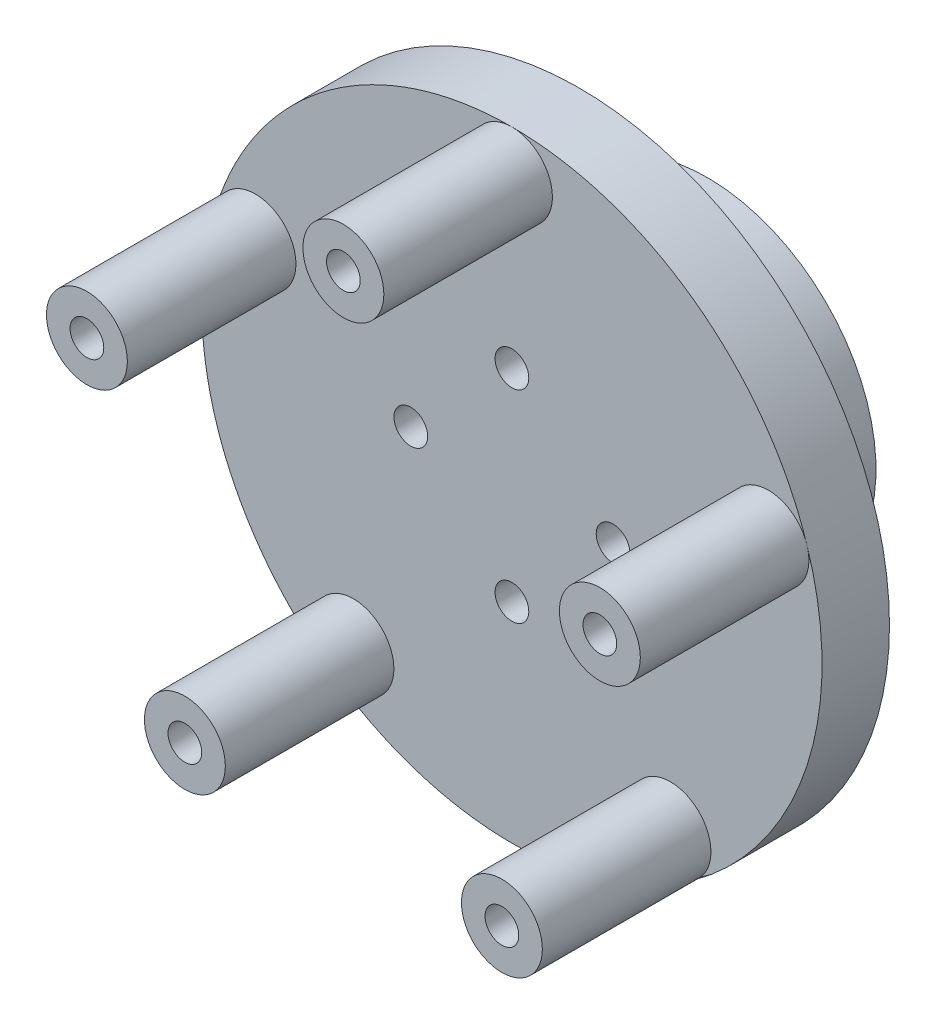
ISO-10303-21;
HEADER;
FILE_DESCRIPTION(('STEP AP214'),'2;1');
FILE_NAME('part.step','',(''),(''),'','','');
FILE_SCHEMA(('AUTOMOTIVE_DESIGN { 1 0 10303 214 1 1 1 1 }'));
ENDSEC;
DATA;
#1=APPLICATION_CONTEXT('core data for automotive mechanical design processes');
#2=APPLICATION_PROTOCOL_DEFINITION('international standard','automotive_design',2000,#1);
#3=PRODUCT_CONTEXT('',#1,'mechanical');
#4=PRODUCT('Part','Part','',(#3));
#5=PRODUCT_RELATED_PRODUCT_CATEGORY('part','',(#4));
#6=PRODUCT_DEFINITION_FORMATION('','',#4);
#7=PRODUCT_DEFINITION_CONTEXT('part definition',#1,'design');
#8=PRODUCT_DEFINITION('design','',#6,#7);
#9=PRODUCT_DEFINITION_SHAPE('','',#8);
#10=(LENGTH_UNIT() NAMED_UNIT(*) SI_UNIT(.MILLI.,.METRE.));
#11=(NAMED_UNIT(*) PLANE_ANGLE_UNIT() SI_UNIT($,.RADIAN.));
#12=(NAMED_UNIT(*) SI_UNIT($,.STERADIAN.) SOLID_ANGLE_UNIT());
#13=UNCERTAINTY_MEASURE_WITH_UNIT(LENGTH_MEASURE(1.E-05),#10,'distance_accuracy_value','');
#14=(GEOMETRIC_REPRESENTATION_CONTEXT(3) GLOBAL_UNCERTAINTY_ASSIGNED_CONTEXT((#13)) GLOBAL_UNIT_ASSIGNED_CONTEXT((#10,
#11,#12)) REPRESENTATION_CONTEXT('',''));
#15=CARTESIAN_POINT('',(0.,0.,0.));
#16=DIRECTION('',(0.,0.,1.));
#17=DIRECTION('',(1.,0.,0.));
#18=AXIS2_PLACEMENT_3D('',#15,#16,#17);
#19=CARTESIAN_POINT('',(0.,0.,5.));
#20=DIRECTION('',(0.,0.,-1.));
#21=DIRECTION('',(-1.,0.,0.));
#22=AXIS2_PLACEMENT_3D('',#19,#20,#21);
#23=CYLINDRICAL_SURFACE('',#22,23.);
#24=CARTESIAN_POINT('',(0.,0.,5.));
#25=DIRECTION('',(0.,0.,1.));
#26=DIRECTION('',(1.,0.,0.));
#27=AXIS2_PLACEMENT_3D('',#24,#25,#26);
#28=CIRCLE('',#27,23.);
#29=CARTESIAN_POINT('',(21.8742998747887,7.10739087062343,5.));
#30=VERTEX_POINT('',#29);
#31=CARTESIAN_POINT('',(0.,23.,5.));
#32=VERTEX_POINT('',#31);
#33=EDGE_CURVE('E53',#30,#32,#28,.T.);
#34=ORIENTED_EDGE('',*,*,#33,.F.);
#35=CARTESIAN_POINT('',(13.5190608027265,-18.6073908706241,5.));
#36=VERTEX_POINT('',#35);
#37=EDGE_CURVE('E85',#36,#30,#28,.T.);
#38=ORIENTED_EDGE('',*,*,#37,.F.);
#39=CARTESIAN_POINT('',(-13.5190608027273,-18.6073908706235,5.));
#40=VERTEX_POINT('',#39);
#41=EDGE_CURVE('E87',#40,#36,#28,.T.);
#42=ORIENTED_EDGE('',*,*,#41,.F.);
#43=CARTESIAN_POINT('',(-21.8742998747881,7.10739087062364,5.));
#44=VERTEX_POINT('',#43);
#45=EDGE_CURVE('E66',#44,#40,#28,.T.);
#46=ORIENTED_EDGE('',*,*,#45,.F.);
#47=EDGE_CURVE('E61',#32,#44,#28,.T.);
#48=ORIENTED_EDGE('',*,*,#47,.F.);
#49=EDGE_LOOP('',(#34,#38,#42,#46,#48));
#50=FACE_BOUND('',#49,.T.);
#51=CARTESIAN_POINT('',(0.,0.,0.));
#52=DIRECTION('',(0.,0.,1.));
#53=DIRECTION('',(1.,0.,0.));
#54=AXIS2_PLACEMENT_3D('',#51,#52,#53);
#55=CIRCLE('',#54,23.);
#56=CARTESIAN_POINT('',(23.,0.,0.));
#57=VERTEX_POINT('',#56);
#58=EDGE_CURVE('E48',#57,#57,#55,.T.);
#59=ORIENTED_EDGE('',*,*,#58,.T.);
#60=EDGE_LOOP('',(#59));
#61=FACE_BOUND('',#60,.T.);
#62=ADVANCED_FACE('F45',(#50,#61),#23,.T.);
#63=CARTESIAN_POINT('',(0.,0.,5.));
#64=DIRECTION('',(0.,0.,1.));
#65=DIRECTION('',(1.,0.,0.));
#66=AXIS2_PLACEMENT_3D('',#63,#64,#65);
#67=PLANE('',#66);
#68=CARTESIAN_POINT('',(0.,7.5,5.));
#69=DIRECTION('',(0.,0.,1.));
#70=DIRECTION('',(1.,0.,0.));
#71=AXIS2_PLACEMENT_3D('',#68,#69,#70);
#72=CIRCLE('',#71,1.25);
#73=CARTESIAN_POINT('',(1.25,7.5,5.));
#74=VERTEX_POINT('',#73);
#75=EDGE_CURVE('E166',#74,#74,#72,.T.);
#76=ORIENTED_EDGE('',*,*,#75,.F.);
#77=EDGE_LOOP('',(#76));
#78=FACE_BOUND('',#77,.T.);
#79=CARTESIAN_POINT('',(-7.5,0.,5.));
#80=DIRECTION('',(0.,0.,1.));
#81=DIRECTION('',(1.,0.,0.));
#82=AXIS2_PLACEMENT_3D('',#79,#80,#81);
#83=CIRCLE('',#82,1.25);
#84=CARTESIAN_POINT('',(-6.25,0.,5.));
#85=VERTEX_POINT('',#84);
#86=EDGE_CURVE('E160',#85,#85,#83,.T.);
#87=ORIENTED_EDGE('',*,*,#86,.F.);
#88=EDGE_LOOP('',(#87));
#89=FACE_BOUND('',#88,.T.);
#90=CARTESIAN_POINT('',(0.,-7.5,5.));
#91=DIRECTION('',(0.,0.,1.));
#92=DIRECTION('',(1.,0.,0.));
#93=AXIS2_PLACEMENT_3D('',#90,#91,#92);
#94=CIRCLE('',#93,1.25);
#95=CARTESIAN_POINT('',(1.25,-7.5,5.));
#96=VERTEX_POINT('',#95);
#97=EDGE_CURVE('E154',#96,#96,#94,.T.);
#98=ORIENTED_EDGE('',*,*,#97,.F.);
#99=EDGE_LOOP('',(#98));
#100=FACE_BOUND('',#99,.T.);
#101=CARTESIAN_POINT('',(7.5,0.,5.));
#102=DIRECTION('',(0.,0.,1.));
#103=DIRECTION('',(1.,0.,0.));
#104=AXIS2_PLACEMENT_3D('',#101,#102,#103);
#105=CIRCLE('',#104,1.25);
#106=CARTESIAN_POINT('',(8.75,0.,5.));
#107=VERTEX_POINT('',#106);
#108=EDGE_CURVE('E148',#107,#107,#105,.T.);
#109=ORIENTED_EDGE('',*,*,#108,.F.);
#110=EDGE_LOOP('',(#109));
#111=FACE_BOUND('',#110,.T.);
#112=ORIENTED_EDGE('',*,*,#47,.T.);
#113=CARTESIAN_POINT('',(-19.0211303259031,6.18033988749895,5.));
#114=DIRECTION('',(0.,0.,1.));
#115=DIRECTION('',(1.,0.,0.));
#116=AXIS2_PLACEMENT_3D('',#113,#114,#115);
#117=CIRCLE('',#116,2.99999999999952);
#118=EDGE_CURVE('E110',#44,#44,#117,.T.);
#119=ORIENTED_EDGE('',*,*,#118,.F.);
#120=ORIENTED_EDGE('',*,*,#45,.T.);
#121=CARTESIAN_POINT('',(-11.7557050458498,-16.1803398874987,5.));
#122=DIRECTION('',(0.,0.,1.));
#123=DIRECTION('',(1.,0.,0.));
#124=AXIS2_PLACEMENT_3D('',#121,#122,#123);
#125=CIRCLE('',#124,3.00000000000001);
#126=EDGE_CURVE('E104',#40,#40,#125,.T.);
#127=ORIENTED_EDGE('',*,*,#126,.F.);
#128=ORIENTED_EDGE('',*,*,#41,.T.);
#129=CARTESIAN_POINT('',(11.7557050458491,-16.1803398874992,5.));
#130=DIRECTION('',(0.,0.,1.));
#131=DIRECTION('',(1.,0.,0.));
#132=AXIS2_PLACEMENT_3D('',#129,#130,#131);
#133=CIRCLE('',#132,3.);
#134=EDGE_CURVE('E98',#36,#36,#133,.T.);
#135=ORIENTED_EDGE('',*,*,#134,.F.);
#136=ORIENTED_EDGE('',*,*,#37,.T.);
#137=CARTESIAN_POINT('',(19.0211303259032,6.18033988749863,5.));
#138=DIRECTION('',(0.,0.,1.));
#139=DIRECTION('',(1.,0.,0.));
#140=AXIS2_PLACEMENT_3D('',#137,#138,#139);
#141=CIRCLE('',#140,3.);
#142=EDGE_CURVE('E82',#30,#30,#141,.T.);
#143=ORIENTED_EDGE('',*,*,#142,.F.);
#144=ORIENTED_EDGE('',*,*,#33,.T.);
#145=CARTESIAN_POINT('',(0.,20.,5.));
#146=DIRECTION('',(0.,0.,1.));
#147=DIRECTION('',(1.,0.,0.));
#148=AXIS2_PLACEMENT_3D('',#145,#146,#147);
#149=CIRCLE('',#148,3.);
#150=EDGE_CURVE('E79',#32,#32,#149,.T.);
#151=ORIENTED_EDGE('',*,*,#150,.F.);
#152=EDGE_LOOP('',(#112,#119,#120,#127,#128,#135,#136,#143,#144,#151));
#153=FACE_BOUND('',#152,.T.);
#154=ADVANCED_FACE('F77',(#78,#89,#100,#111,#153),#67,.T.);
#155=CARTESIAN_POINT('',(0.,0.,0.));
#156=DIRECTION('',(0.,0.,1.));
#157=DIRECTION('',(1.,0.,0.));
#158=AXIS2_PLACEMENT_3D('',#155,#156,#157);
#159=PLANE('',#158);
#160=CARTESIAN_POINT('',(19.021130325903,6.18033988749916,0.));
#161=DIRECTION('',(0.,0.,1.));
#162=DIRECTION('',(1.,0.,0.));
#163=AXIS2_PLACEMENT_3D('',#160,#161,#162);
#164=CIRCLE('',#163,1.25);
#165=CARTESIAN_POINT('',(20.271130325903,6.18033988749916,0.));
#166=VERTEX_POINT('',#165);
#167=EDGE_CURVE('E142',#166,#166,#164,.T.);
#168=ORIENTED_EDGE('',*,*,#167,.T.);
#169=EDGE_LOOP('',(#168));
#170=FACE_BOUND('',#169,.T.);
#171=CARTESIAN_POINT('',(11.7557050458496,-16.1803398874988,0.));
#172=DIRECTION('',(0.,0.,1.));
#173=DIRECTION('',(1.,0.,0.));
#174=AXIS2_PLACEMENT_3D('',#171,#172,#173);
#175=CIRCLE('',#174,1.25);
#176=CARTESIAN_POINT('',(13.0057050458496,-16.1803398874988,0.));
#177=VERTEX_POINT('',#176);
#178=EDGE_CURVE('E136',#177,#177,#175,.T.);
#179=ORIENTED_EDGE('',*,*,#178,.T.);
#180=EDGE_LOOP('',(#179));
#181=FACE_BOUND('',#180,.T.);
#182=CARTESIAN_POINT('',(-11.7557050458494,-16.180339887499,0.));
#183=DIRECTION('',(0.,0.,1.));
#184=DIRECTION('',(1.,0.,0.));
#185=AXIS2_PLACEMENT_3D('',#182,#183,#184);
#186=CIRCLE('',#185,1.25);
#187=CARTESIAN_POINT('',(-10.5057050458494,-16.180339887499,0.));
#188=VERTEX_POINT('',#187);
#189=EDGE_CURVE('E130',#188,#188,#186,.T.);
#190=ORIENTED_EDGE('',*,*,#189,.T.);
#191=EDGE_LOOP('',(#190));
#192=FACE_BOUND('',#191,.T.);
#193=CARTESIAN_POINT('',(-19.0211303259031,6.1803398874989,0.));
#194=DIRECTION('',(0.,0.,1.));
#195=DIRECTION('',(1.,0.,0.));
#196=AXIS2_PLACEMENT_3D('',#193,#194,#195);
#197=CIRCLE('',#196,1.25);
#198=CARTESIAN_POINT('',(-17.7711303259031,6.1803398874989,0.));
#199=VERTEX_POINT('',#198);
#200=EDGE_CURVE('E124',#199,#199,#197,.T.);
#201=ORIENTED_EDGE('',*,*,#200,.T.);
#202=EDGE_LOOP('',(#201));
#203=FACE_BOUND('',#202,.T.);
#204=CARTESIAN_POINT('',(0.,20.,0.));
#205=DIRECTION('',(0.,0.,1.));
#206=DIRECTION('',(1.,0.,0.));
#207=AXIS2_PLACEMENT_3D('',#204,#205,#206);
#208=CIRCLE('',#207,1.25);
#209=CARTESIAN_POINT('',(1.25,20.,0.));
#210=VERTEX_POINT('',#209);
#211=EDGE_CURVE('E118',#210,#210,#208,.T.);
#212=ORIENTED_EDGE('',*,*,#211,.T.);
#213=EDGE_LOOP('',(#212));
#214=FACE_BOUND('',#213,.T.);
#215=CARTESIAN_POINT('',(0.,0.,0.));
#216=DIRECTION('',(0.,0.,-1.));
#217=DIRECTION('',(-1.,0.,0.));
#218=AXIS2_PLACEMENT_3D('',#215,#216,#217);
#219=CIRCLE('',#218,12.5);
#220=CARTESIAN_POINT('',(-12.5,0.,0.));
#221=VERTEX_POINT('',#220);
#222=EDGE_CURVE('E11',#221,#221,#219,.T.);
#223=ORIENTED_EDGE('',*,*,#222,.F.);
#224=EDGE_LOOP('',(#223));
#225=FACE_BOUND('',#224,.T.);
#226=ORIENTED_EDGE('',*,*,#58,.F.);
#227=EDGE_LOOP('',(#226));
#228=FACE_BOUND('',#227,.T.);
#229=ADVANCED_FACE('F196',(#170,#181,#192,#203,#214,#225,#228),#159,.F.);
#230=CARTESIAN_POINT('',(0.,20.,17.5));
#231=DIRECTION('',(0.,0.,-1.));
#232=DIRECTION('',(-1.,0.,0.));
#233=AXIS2_PLACEMENT_3D('',#230,#231,#232);
#234=CYLINDRICAL_SURFACE('',#233,3.);
#235=CARTESIAN_POINT('',(0.,20.,17.5));
#236=DIRECTION('',(0.,0.,1.));
#237=DIRECTION('',(1.,0.,0.));
#238=AXIS2_PLACEMENT_3D('',#235,#236,#237);
#239=CIRCLE('',#238,3.);
#240=CARTESIAN_POINT('',(3.,20.,17.5));
#241=VERTEX_POINT('',#240);
#242=EDGE_CURVE('E90',#241,#241,#239,.T.);
#243=ORIENTED_EDGE('',*,*,#242,.F.);
#244=EDGE_LOOP('',(#243));
#245=FACE_BOUND('',#244,.T.);
#246=ORIENTED_EDGE('',*,*,#150,.T.);
#247=EDGE_LOOP('',(#246));
#248=FACE_BOUND('',#247,.T.);
#249=ADVANCED_FACE('F199',(#245,#248),#234,.T.);
#250=CARTESIAN_POINT('',(0.,0.,17.5));
#251=DIRECTION('',(0.,0.,1.));
#252=DIRECTION('',(1.,0.,0.));
#253=AXIS2_PLACEMENT_3D('',#250,#251,#252);
#254=PLANE('',#253);
#255=CARTESIAN_POINT('',(0.,20.,17.5));
#256=DIRECTION('',(0.,0.,1.));
#257=DIRECTION('',(1.,0.,0.));
#258=AXIS2_PLACEMENT_3D('',#255,#256,#257);
#259=CIRCLE('',#258,1.25);
#260=CARTESIAN_POINT('',(1.25,20.,17.5));
#261=VERTEX_POINT('',#260);
#262=EDGE_CURVE('E121',#261,#261,#259,.T.);
#263=ORIENTED_EDGE('',*,*,#262,.F.);
#264=EDGE_LOOP('',(#263));
#265=FACE_BOUND('',#264,.T.);
#266=ORIENTED_EDGE('',*,*,#242,.T.);
#267=EDGE_LOOP('',(#266));
#268=FACE_BOUND('',#267,.T.);
#269=ADVANCED_FACE('F239',(#265,#268),#254,.T.);
#270=CARTESIAN_POINT('',(19.0211303259032,6.18033988749863,17.5));
#271=DIRECTION('',(0.,0.,-1.));
#272=DIRECTION('',(-1.,0.,0.));
#273=AXIS2_PLACEMENT_3D('',#270,#271,#272);
#274=CYLINDRICAL_SURFACE('',#273,3.);
#275=CARTESIAN_POINT('',(19.0211303259032,6.18033988749863,17.5));
#276=DIRECTION('',(0.,0.,1.));
#277=DIRECTION('',(1.,0.,0.));
#278=AXIS2_PLACEMENT_3D('',#275,#276,#277);
#279=CIRCLE('',#278,3.);
#280=CARTESIAN_POINT('',(22.0211303259032,6.18033988749863,17.5));
#281=VERTEX_POINT('',#280);
#282=EDGE_CURVE('E95',#281,#281,#279,.T.);
#283=ORIENTED_EDGE('',*,*,#282,.F.);
#284=EDGE_LOOP('',(#283));
#285=FACE_BOUND('',#284,.T.);
#286=ORIENTED_EDGE('',*,*,#142,.T.);
#287=EDGE_LOOP('',(#286));
#288=FACE_BOUND('',#287,.T.);
#289=ADVANCED_FACE('F243',(#285,#288),#274,.T.);
#290=CARTESIAN_POINT('',(0.,0.,17.5));
#291=DIRECTION('',(0.,0.,1.));
#292=DIRECTION('',(1.,0.,0.));
#293=AXIS2_PLACEMENT_3D('',#290,#291,#292);
#294=PLANE('',#293);
#295=CARTESIAN_POINT('',(19.021130325903,6.18033988749916,17.5));
#296=DIRECTION('',(0.,0.,1.));
#297=DIRECTION('',(1.,0.,0.));
#298=AXIS2_PLACEMENT_3D('',#295,#296,#297);
#299=CIRCLE('',#298,1.25);
#300=CARTESIAN_POINT('',(20.271130325903,6.18033988749916,17.5));
#301=VERTEX_POINT('',#300);
#302=EDGE_CURVE('E145',#301,#301,#299,.T.);
#303=ORIENTED_EDGE('',*,*,#302,.F.);
#304=EDGE_LOOP('',(#303));
#305=FACE_BOUND('',#304,.T.);
#306=ORIENTED_EDGE('',*,*,#282,.T.);
#307=EDGE_LOOP('',(#306));
#308=FACE_BOUND('',#307,.T.);
#309=ADVANCED_FACE('F247',(#305,#308),#294,.T.);
#310=CARTESIAN_POINT('',(11.7557050458491,-16.1803398874992,17.5));
#311=DIRECTION('',(0.,0.,-1.));
#312=DIRECTION('',(-1.,0.,0.));
#313=AXIS2_PLACEMENT_3D('',#310,#311,#312);
#314=CYLINDRICAL_SURFACE('',#313,3.);
#315=CARTESIAN_POINT('',(11.7557050458491,-16.1803398874992,17.5));
#316=DIRECTION('',(0.,0.,1.));
#317=DIRECTION('',(1.,0.,0.));
#318=AXIS2_PLACEMENT_3D('',#315,#316,#317);
#319=CIRCLE('',#318,3.);
#320=CARTESIAN_POINT('',(14.7557050458492,-16.1803398874992,17.5));
#321=VERTEX_POINT('',#320);
#322=EDGE_CURVE('E101',#321,#321,#319,.T.);
#323=ORIENTED_EDGE('',*,*,#322,.F.);
#324=EDGE_LOOP('',(#323));
#325=FACE_BOUND('',#324,.T.);
#326=ORIENTED_EDGE('',*,*,#134,.T.);
#327=EDGE_LOOP('',(#326));
#328=FACE_BOUND('',#327,.T.);
#329=ADVANCED_FACE('F220',(#325,#328),#314,.T.);
#330=CARTESIAN_POINT('',(0.,0.,17.5));
#331=DIRECTION('',(0.,0.,1.));
#332=DIRECTION('',(1.,0.,0.));
#333=AXIS2_PLACEMENT_3D('',#330,#331,#332);
#334=PLANE('',#333);
#335=CARTESIAN_POINT('',(11.7557050458496,-16.1803398874988,17.5));
#336=DIRECTION('',(0.,0.,1.));
#337=DIRECTION('',(1.,0.,0.));
#338=AXIS2_PLACEMENT_3D('',#335,#336,#337);
#339=CIRCLE('',#338,1.25);
#340=CARTESIAN_POINT('',(13.0057050458496,-16.1803398874988,17.5));
#341=VERTEX_POINT('',#340);
#342=EDGE_CURVE('E139',#341,#341,#339,.T.);
#343=ORIENTED_EDGE('',*,*,#342,.F.);
#344=EDGE_LOOP('',(#343));
#345=FACE_BOUND('',#344,.T.);
#346=ORIENTED_EDGE('',*,*,#322,.T.);
#347=EDGE_LOOP('',(#346));
#348=FACE_BOUND('',#347,.T.);
#349=ADVANCED_FACE('F208',(#345,#348),#334,.T.);
#350=CARTESIAN_POINT('',(-11.7557050458498,-16.1803398874987,17.5));
#351=DIRECTION('',(0.,0.,-1.));
#352=DIRECTION('',(-1.,0.,0.));
#353=AXIS2_PLACEMENT_3D('',#350,#351,#352);
#354=CYLINDRICAL_SURFACE('',#353,3.00000000000001);
#355=CARTESIAN_POINT('',(-11.7557050458498,-16.1803398874987,17.5));
#356=DIRECTION('',(0.,0.,1.));
#357=DIRECTION('',(1.,0.,0.));
#358=AXIS2_PLACEMENT_3D('',#355,#356,#357);
#359=CIRCLE('',#358,3.00000000000001);
#360=CARTESIAN_POINT('',(-8.75570504584983,-16.1803398874987,17.5));
#361=VERTEX_POINT('',#360);
#362=EDGE_CURVE('E107',#361,#361,#359,.T.);
#363=ORIENTED_EDGE('',*,*,#362,.F.);
#364=EDGE_LOOP('',(#363));
#365=FACE_BOUND('',#364,.T.);
#366=ORIENTED_EDGE('',*,*,#126,.T.);
#367=EDGE_LOOP('',(#366));
#368=FACE_BOUND('',#367,.T.);
#369=ADVANCED_FACE('F205',(#365,#368),#354,.T.);
#370=CARTESIAN_POINT('',(0.,0.,17.5));
#371=DIRECTION('',(0.,0.,1.));
#372=DIRECTION('',(1.,0.,0.));
#373=AXIS2_PLACEMENT_3D('',#370,#371,#372);
#374=PLANE('',#373);
#375=CARTESIAN_POINT('',(-11.7557050458494,-16.180339887499,17.5));
#376=DIRECTION('',(0.,0.,1.));
#377=DIRECTION('',(1.,0.,0.));
#378=AXIS2_PLACEMENT_3D('',#375,#376,#377);
#379=CIRCLE('',#378,1.25);
#380=CARTESIAN_POINT('',(-10.5057050458494,-16.180339887499,17.5));
#381=VERTEX_POINT('',#380);
#382=EDGE_CURVE('E133',#381,#381,#379,.T.);
#383=ORIENTED_EDGE('',*,*,#382,.F.);
#384=EDGE_LOOP('',(#383));
#385=FACE_BOUND('',#384,.T.);
#386=ORIENTED_EDGE('',*,*,#362,.T.);
#387=EDGE_LOOP('',(#386));
#388=FACE_BOUND('',#387,.T.);
#389=ADVANCED_FACE('F207',(#385,#388),#374,.T.);
#390=CARTESIAN_POINT('',(-19.0211303259031,6.18033988749895,17.5));
#391=DIRECTION('',(0.,0.,-1.));
#392=DIRECTION('',(-1.,0.,0.));
#393=AXIS2_PLACEMENT_3D('',#390,#391,#392);
#394=CYLINDRICAL_SURFACE('',#393,2.99999999999952);
#395=CARTESIAN_POINT('',(-19.0211303259031,6.18033988749895,17.5));
#396=DIRECTION('',(0.,0.,1.));
#397=DIRECTION('',(1.,0.,0.));
#398=AXIS2_PLACEMENT_3D('',#395,#396,#397);
#399=CIRCLE('',#398,2.99999999999952);
#400=CARTESIAN_POINT('',(-16.0211303259036,6.18033988749895,17.5));
#401=VERTEX_POINT('',#400);
#402=EDGE_CURVE('E113',#401,#401,#399,.T.);
#403=ORIENTED_EDGE('',*,*,#402,.F.);
#404=EDGE_LOOP('',(#403));
#405=FACE_BOUND('',#404,.T.);
#406=ORIENTED_EDGE('',*,*,#118,.T.);
#407=EDGE_LOOP('',(#406));
#408=FACE_BOUND('',#407,.T.);
#409=ADVANCED_FACE('F216',(#405,#408),#394,.T.);
#410=CARTESIAN_POINT('',(0.,0.,17.5));
#411=DIRECTION('',(0.,0.,1.));
#412=DIRECTION('',(1.,0.,0.));
#413=AXIS2_PLACEMENT_3D('',#410,#411,#412);
#414=PLANE('',#413);
#415=CARTESIAN_POINT('',(-19.0211303259031,6.1803398874989,17.5));
#416=DIRECTION('',(0.,0.,1.));
#417=DIRECTION('',(1.,0.,0.));
#418=AXIS2_PLACEMENT_3D('',#415,#416,#417);
#419=CIRCLE('',#418,1.25);
#420=CARTESIAN_POINT('',(-17.7711303259031,6.1803398874989,17.5));
#421=VERTEX_POINT('',#420);
#422=EDGE_CURVE('E127',#421,#421,#419,.T.);
#423=ORIENTED_EDGE('',*,*,#422,.F.);
#424=EDGE_LOOP('',(#423));
#425=FACE_BOUND('',#424,.T.);
#426=ORIENTED_EDGE('',*,*,#402,.T.);
#427=EDGE_LOOP('',(#426));
#428=FACE_BOUND('',#427,.T.);
#429=ADVANCED_FACE('F192',(#425,#428),#414,.T.);
#430=CARTESIAN_POINT('',(0.,0.,-9.5));
#431=DIRECTION('',(0.,0.,1.));
#432=DIRECTION('',(1.,0.,0.));
#433=AXIS2_PLACEMENT_3D('',#430,#431,#432);
#434=CYLINDRICAL_SURFACE('',#433,12.5);
#435=CARTESIAN_POINT('',(0.,0.,-9.5));
#436=DIRECTION('',(0.,0.,-1.));
#437=DIRECTION('',(-1.,0.,0.));
#438=AXIS2_PLACEMENT_3D('',#435,#436,#437);
#439=CIRCLE('',#438,12.5);
#440=CARTESIAN_POINT('',(-12.5,0.,-9.5));
#441=VERTEX_POINT('',#440);
#442=EDGE_CURVE('E91',#441,#441,#439,.T.);
#443=ORIENTED_EDGE('',*,*,#442,.F.);
#444=EDGE_LOOP('',(#443));
#445=FACE_BOUND('',#444,.T.);
#446=ORIENTED_EDGE('',*,*,#222,.T.);
#447=EDGE_LOOP('',(#446));
#448=FACE_BOUND('',#447,.T.);
#449=ADVANCED_FACE('F180',(#445,#448),#434,.T.);
#450=CARTESIAN_POINT('',(0.,0.,-9.5));
#451=DIRECTION('',(0.,0.,-1.));
#452=DIRECTION('',(-1.,0.,0.));
#453=AXIS2_PLACEMENT_3D('',#450,#451,#452);
#454=PLANE('',#453);
#455=CARTESIAN_POINT('',(0.,7.5,-9.5));
#456=DIRECTION('',(0.,0.,-1.));
#457=DIRECTION('',(-1.,0.,0.));
#458=AXIS2_PLACEMENT_3D('',#455,#456,#457);
#459=CIRCLE('',#458,1.25);
#460=CARTESIAN_POINT('',(-1.25,7.5,-9.5));
#461=VERTEX_POINT('',#460);
#462=EDGE_CURVE('E169',#461,#461,#459,.T.);
#463=ORIENTED_EDGE('',*,*,#462,.F.);
#464=EDGE_LOOP('',(#463));
#465=FACE_BOUND('',#464,.T.);
#466=CARTESIAN_POINT('',(-7.5,0.,-9.5));
#467=DIRECTION('',(0.,0.,-1.));
#468=DIRECTION('',(-1.,0.,0.));
#469=AXIS2_PLACEMENT_3D('',#466,#467,#468);
#470=CIRCLE('',#469,1.25);
#471=CARTESIAN_POINT('',(-8.75,0.,-9.5));
#472=VERTEX_POINT('',#471);
#473=EDGE_CURVE('E163',#472,#472,#470,.T.);
#474=ORIENTED_EDGE('',*,*,#473,.F.);
#475=EDGE_LOOP('',(#474));
#476=FACE_BOUND('',#475,.T.);
#477=CARTESIAN_POINT('',(0.,-7.5,-9.5));
#478=DIRECTION('',(0.,0.,-1.));
#479=DIRECTION('',(-1.,0.,0.));
#480=AXIS2_PLACEMENT_3D('',#477,#478,#479);
#481=CIRCLE('',#480,1.25);
#482=CARTESIAN_POINT('',(-1.25,-7.5,-9.5));
#483=VERTEX_POINT('',#482);
#484=EDGE_CURVE('E157',#483,#483,#481,.T.);
#485=ORIENTED_EDGE('',*,*,#484,.F.);
#486=EDGE_LOOP('',(#485));
#487=FACE_BOUND('',#486,.T.);
#488=CARTESIAN_POINT('',(7.5,0.,-9.5));
#489=DIRECTION('',(0.,0.,-1.));
#490=DIRECTION('',(-1.,0.,0.));
#491=AXIS2_PLACEMENT_3D('',#488,#489,#490);
#492=CIRCLE('',#491,1.25);
#493=CARTESIAN_POINT('',(6.25,0.,-9.5));
#494=VERTEX_POINT('',#493);
#495=EDGE_CURVE('E151',#494,#494,#492,.T.);
#496=ORIENTED_EDGE('',*,*,#495,.F.);
#497=EDGE_LOOP('',(#496));
#498=FACE_BOUND('',#497,.T.);
#499=ORIENTED_EDGE('',*,*,#442,.T.);
#500=EDGE_LOOP('',(#499));
#501=FACE_BOUND('',#500,.T.);
#502=ADVANCED_FACE('F176',(#465,#476,#487,#498,#501),#454,.T.);
#503=CARTESIAN_POINT('',(0.,20.,17.5));
#504=DIRECTION('',(0.,0.,1.));
#505=DIRECTION('',(1.,0.,0.));
#506=AXIS2_PLACEMENT_3D('',#503,#504,#505);
#507=CYLINDRICAL_SURFACE('',#506,1.25);
#508=ORIENTED_EDGE('',*,*,#211,.F.);
#509=EDGE_LOOP('',(#508));
#510=FACE_BOUND('',#509,.T.);
#511=ORIENTED_EDGE('',*,*,#262,.T.);
#512=EDGE_LOOP('',(#511));
#513=FACE_BOUND('',#512,.T.);
#514=ADVANCED_FACE('F179',(#510,#513),#507,.F.);
#515=CARTESIAN_POINT('',(-19.0211303259031,6.1803398874989,17.5));
#516=DIRECTION('',(0.,0.,1.));
#517=DIRECTION('',(1.,0.,0.));
#518=AXIS2_PLACEMENT_3D('',#515,#516,#517);
#519=CYLINDRICAL_SURFACE('',#518,1.25);
#520=ORIENTED_EDGE('',*,*,#200,.F.);
#521=EDGE_LOOP('',(#520));
#522=FACE_BOUND('',#521,.T.);
#523=ORIENTED_EDGE('',*,*,#422,.T.);
#524=EDGE_LOOP('',(#523));
#525=FACE_BOUND('',#524,.T.);
#526=ADVANCED_FACE('F294',(#522,#525),#519,.F.);
#527=CARTESIAN_POINT('',(-11.7557050458494,-16.180339887499,17.5));
#528=DIRECTION('',(0.,0.,1.));
#529=DIRECTION('',(1.,0.,0.));
#530=AXIS2_PLACEMENT_3D('',#527,#528,#529);
#531=CYLINDRICAL_SURFACE('',#530,1.25);
#532=ORIENTED_EDGE('',*,*,#189,.F.);
#533=EDGE_LOOP('',(#532));
#534=FACE_BOUND('',#533,.T.);
#535=ORIENTED_EDGE('',*,*,#382,.T.);
#536=EDGE_LOOP('',(#535));
#537=FACE_BOUND('',#536,.T.);
#538=ADVANCED_FACE('F343',(#534,#537),#531,.F.);
#539=CARTESIAN_POINT('',(11.7557050458496,-16.1803398874988,17.5));
#540=DIRECTION('',(0.,0.,1.));
#541=DIRECTION('',(1.,0.,0.));
#542=AXIS2_PLACEMENT_3D('',#539,#540,#541);
#543=CYLINDRICAL_SURFACE('',#542,1.25);
#544=ORIENTED_EDGE('',*,*,#178,.F.);
#545=EDGE_LOOP('',(#544));
#546=FACE_BOUND('',#545,.T.);
#547=ORIENTED_EDGE('',*,*,#342,.T.);
#548=EDGE_LOOP('',(#547));
#549=FACE_BOUND('',#548,.T.);
#550=ADVANCED_FACE('F355',(#546,#549),#543,.F.);
#551=CARTESIAN_POINT('',(19.021130325903,6.18033988749916,17.5));
#552=DIRECTION('',(0.,0.,1.));
#553=DIRECTION('',(1.,0.,0.));
#554=AXIS2_PLACEMENT_3D('',#551,#552,#553);
#555=CYLINDRICAL_SURFACE('',#554,1.25);
#556=ORIENTED_EDGE('',*,*,#167,.F.);
#557=EDGE_LOOP('',(#556));
#558=FACE_BOUND('',#557,.T.);
#559=ORIENTED_EDGE('',*,*,#302,.T.);
#560=EDGE_LOOP('',(#559));
#561=FACE_BOUND('',#560,.T.);
#562=ADVANCED_FACE('F366',(#558,#561),#555,.F.);
#563=CARTESIAN_POINT('',(7.5,0.,-9.5));
#564=DIRECTION('',(0.,0.,-1.));
#565=DIRECTION('',(-1.,0.,0.));
#566=AXIS2_PLACEMENT_3D('',#563,#564,#565);
#567=CYLINDRICAL_SURFACE('',#566,1.25);
#568=ORIENTED_EDGE('',*,*,#495,.T.);
#569=EDGE_LOOP('',(#568));
#570=FACE_BOUND('',#569,.T.);
#571=ORIENTED_EDGE('',*,*,#108,.T.);
#572=EDGE_LOOP('',(#571));
#573=FACE_BOUND('',#572,.T.);
#574=ADVANCED_FACE('F376',(#570,#573),#567,.F.);
#575=CARTESIAN_POINT('',(0.,-7.5,-9.5));
#576=DIRECTION('',(0.,0.,-1.));
#577=DIRECTION('',(-1.,0.,0.));
#578=AXIS2_PLACEMENT_3D('',#575,#576,#577);
#579=CYLINDRICAL_SURFACE('',#578,1.25);
#580=ORIENTED_EDGE('',*,*,#484,.T.);
#581=EDGE_LOOP('',(#580));
#582=FACE_BOUND('',#581,.T.);
#583=ORIENTED_EDGE('',*,*,#97,.T.);
#584=EDGE_LOOP('',(#583));
#585=FACE_BOUND('',#584,.T.);
#586=ADVANCED_FACE('F405',(#582,#585),#579,.F.);
#587=CARTESIAN_POINT('',(-7.5,0.,-9.5));
#588=DIRECTION('',(0.,0.,-1.));
#589=DIRECTION('',(-1.,0.,0.));
#590=AXIS2_PLACEMENT_3D('',#587,#588,#589);
#591=CYLINDRICAL_SURFACE('',#590,1.25);
#592=ORIENTED_EDGE('',*,*,#473,.T.);
#593=EDGE_LOOP('',(#592));
#594=FACE_BOUND('',#593,.T.);
#595=ORIENTED_EDGE('',*,*,#86,.T.);
#596=EDGE_LOOP('',(#595));
#597=FACE_BOUND('',#596,.T.);
#598=ADVANCED_FACE('F395',(#594,#597),#591,.F.);
#599=CARTESIAN_POINT('',(0.,7.5,-9.5));
#600=DIRECTION('',(0.,0.,-1.));
#601=DIRECTION('',(-1.,0.,0.));
#602=AXIS2_PLACEMENT_3D('',#599,#600,#601);
#603=CYLINDRICAL_SURFACE('',#602,1.25);
#604=ORIENTED_EDGE('',*,*,#462,.T.);
#605=EDGE_LOOP('',(#604));
#606=FACE_BOUND('',#605,.T.);
#607=ORIENTED_EDGE('',*,*,#75,.T.);
#608=EDGE_LOOP('',(#607));
#609=FACE_BOUND('',#608,.T.);
#610=ADVANCED_FACE('F173',(#606,#609),#603,.F.);
#611=CLOSED_SHELL('',(#62,#154,#229,#249,#269,#289,#309,#329,#349,#369,#389,#409,#429,#449,#502,
#514,#526,#538,#550,#562,#574,#586,#598,#610));
#612=MANIFOLD_SOLID_BREP('B2',#611);
#613=ADVANCED_BREP_SHAPE_REPRESENTATION('',(#18,#612),#14);
#614=SHAPE_DEFINITION_REPRESENTATION(#9,#613);
ENDSEC;
END-ISO-10303-21;
